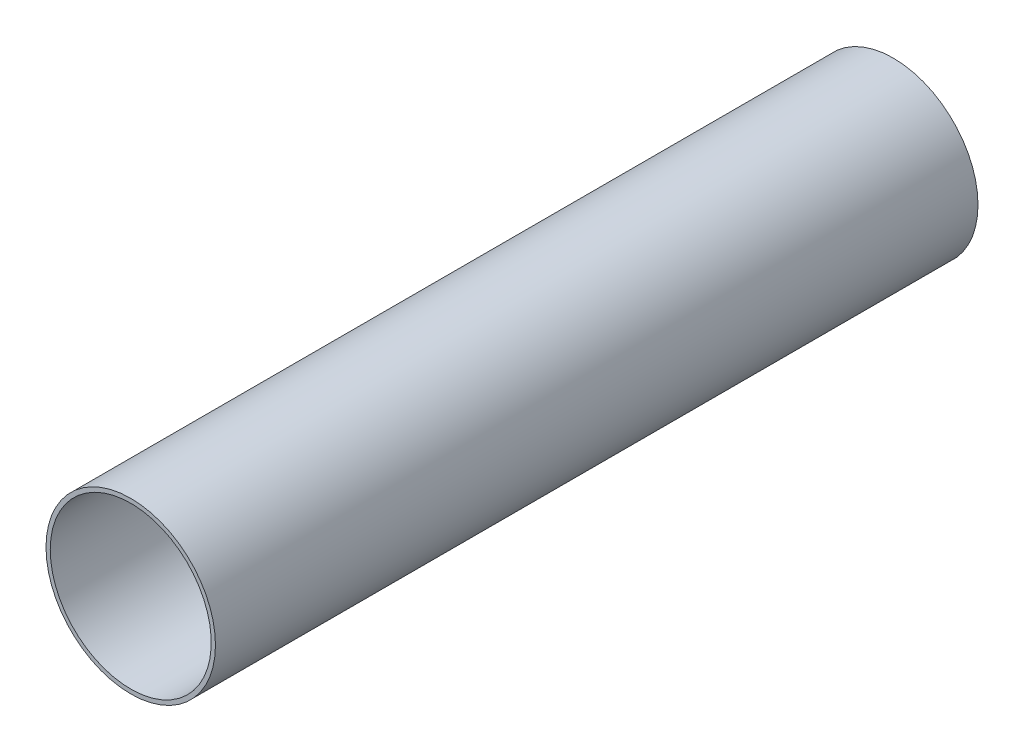
ISO-10303-21;
HEADER;
FILE_DESCRIPTION(('STEP AP214'),'2;1');
FILE_NAME('part.step','',(''),(''),'','','');
FILE_SCHEMA(('AUTOMOTIVE_DESIGN { 1 0 10303 214 1 1 1 1 }'));
ENDSEC;
DATA;
#1=APPLICATION_CONTEXT('core data for automotive mechanical design processes');
#2=APPLICATION_PROTOCOL_DEFINITION('international standard','automotive_design',2000,#1);
#3=PRODUCT_CONTEXT('',#1,'mechanical');
#4=PRODUCT('Part','Part','',(#3));
#5=PRODUCT_RELATED_PRODUCT_CATEGORY('part','',(#4));
#6=PRODUCT_DEFINITION_FORMATION('','',#4);
#7=PRODUCT_DEFINITION_CONTEXT('part definition',#1,'design');
#8=PRODUCT_DEFINITION('design','',#6,#7);
#9=PRODUCT_DEFINITION_SHAPE('','',#8);
#10=(LENGTH_UNIT() NAMED_UNIT(*) SI_UNIT(.MILLI.,.METRE.));
#11=(NAMED_UNIT(*) PLANE_ANGLE_UNIT() SI_UNIT($,.RADIAN.));
#12=(NAMED_UNIT(*) SI_UNIT($,.STERADIAN.) SOLID_ANGLE_UNIT());
#13=UNCERTAINTY_MEASURE_WITH_UNIT(LENGTH_MEASURE(1.E-05),#10,'distance_accuracy_value','');
#14=(GEOMETRIC_REPRESENTATION_CONTEXT(3) GLOBAL_UNCERTAINTY_ASSIGNED_CONTEXT((#13)) GLOBAL_UNIT_ASSIGNED_CONTEXT((#10,
#11,#12)) REPRESENTATION_CONTEXT('',''));
#15=CARTESIAN_POINT('',(0.,0.,0.));
#16=DIRECTION('',(0.,0.,1.));
#17=DIRECTION('',(1.,0.,0.));
#18=AXIS2_PLACEMENT_3D('',#15,#16,#17);
#19=CARTESIAN_POINT('',(0.,0.,90.));
#20=DIRECTION('',(0.,0.,1.));
#21=DIRECTION('',(1.,0.,0.));
#22=AXIS2_PLACEMENT_3D('',#19,#20,#21);
#23=PLANE('',#22);
#24=CARTESIAN_POINT('',(0.,0.,90.));
#25=DIRECTION('',(0.,0.,1.));
#26=DIRECTION('',(1.,0.,0.));
#27=AXIS2_PLACEMENT_3D('',#24,#25,#26);
#28=CIRCLE('',#27,10.);
#29=CARTESIAN_POINT('',(-10.,0.,90.));
#30=VERTEX_POINT('',#29);
#31=EDGE_CURVE('E10',#30,#30,#28,.T.);
#32=ORIENTED_EDGE('',*,*,#31,.T.);
#33=EDGE_LOOP('',(#32));
#34=FACE_BOUND('',#33,.T.);
#35=CARTESIAN_POINT('',(0.,0.,90.));
#36=DIRECTION('',(0.,0.,1.));
#37=DIRECTION('',(1.,0.,0.));
#38=AXIS2_PLACEMENT_3D('',#35,#36,#37);
#39=CIRCLE('',#38,9.5);
#40=CARTESIAN_POINT('',(-9.5,0.,90.));
#41=VERTEX_POINT('',#40);
#42=EDGE_CURVE('E41',#41,#41,#39,.T.);
#43=ORIENTED_EDGE('',*,*,#42,.F.);
#44=EDGE_LOOP('',(#43));
#45=FACE_BOUND('',#44,.T.);
#46=ADVANCED_FACE('F30',(#34,#45),#23,.T.);
#47=CARTESIAN_POINT('',(0.,0.,0.));
#48=DIRECTION('',(0.,0.,1.));
#49=DIRECTION('',(1.,0.,0.));
#50=AXIS2_PLACEMENT_3D('',#47,#48,#49);
#51=PLANE('',#50);
#52=CARTESIAN_POINT('',(0.,0.,0.));
#53=DIRECTION('',(0.,0.,1.));
#54=DIRECTION('',(1.,0.,0.));
#55=AXIS2_PLACEMENT_3D('',#52,#53,#54);
#56=CIRCLE('',#55,10.);
#57=CARTESIAN_POINT('',(-10.,0.,0.));
#58=VERTEX_POINT('',#57);
#59=EDGE_CURVE('E34',#58,#58,#56,.T.);
#60=ORIENTED_EDGE('',*,*,#59,.F.);
#61=EDGE_LOOP('',(#60));
#62=FACE_BOUND('',#61,.T.);
#63=CARTESIAN_POINT('',(0.,0.,0.));
#64=DIRECTION('',(0.,0.,1.));
#65=DIRECTION('',(1.,0.,0.));
#66=AXIS2_PLACEMENT_3D('',#63,#64,#65);
#67=CIRCLE('',#66,9.5);
#68=CARTESIAN_POINT('',(-9.5,0.,0.));
#69=VERTEX_POINT('',#68);
#70=EDGE_CURVE('E43',#69,#69,#67,.T.);
#71=ORIENTED_EDGE('',*,*,#70,.T.);
#72=EDGE_LOOP('',(#71));
#73=FACE_BOUND('',#72,.T.);
#74=ADVANCED_FACE('F53',(#62,#73),#51,.F.);
#75=CARTESIAN_POINT('',(0.,0.,90.));
#76=DIRECTION('',(0.,0.,-1.));
#77=DIRECTION('',(-1.,0.,0.));
#78=AXIS2_PLACEMENT_3D('',#75,#76,#77);
#79=CYLINDRICAL_SURFACE('',#78,10.);
#80=CARTESIAN_POINT('',(-10.,0.,90.));
#81=CARTESIAN_POINT('',(-10.,0.,89.0625));
#82=CARTESIAN_POINT('',(-10.,0.,88.125));
#83=CARTESIAN_POINT('',(-10.,0.,86.25));
#84=CARTESIAN_POINT('',(-10.,0.,85.3125));
#85=CARTESIAN_POINT('',(-10.,0.,83.4375));
#86=CARTESIAN_POINT('',(-10.,0.,82.5));
#87=CARTESIAN_POINT('',(-10.,0.,80.625));
#88=CARTESIAN_POINT('',(-10.,0.,79.6875));
#89=CARTESIAN_POINT('',(-10.,0.,77.8125));
#90=CARTESIAN_POINT('',(-10.,0.,76.875));
#91=CARTESIAN_POINT('',(-10.,0.,75.));
#92=CARTESIAN_POINT('',(-10.,0.,74.0625));
#93=CARTESIAN_POINT('',(-10.,0.,72.1875));
#94=CARTESIAN_POINT('',(-10.,0.,71.25));
#95=CARTESIAN_POINT('',(-10.,0.,69.375));
#96=CARTESIAN_POINT('',(-10.,0.,68.4375));
#97=CARTESIAN_POINT('',(-10.,0.,66.5625));
#98=CARTESIAN_POINT('',(-10.,0.,65.625));
#99=CARTESIAN_POINT('',(-10.,0.,63.75));
#100=CARTESIAN_POINT('',(-10.,0.,62.8125));
#101=CARTESIAN_POINT('',(-10.,0.,60.9375));
#102=CARTESIAN_POINT('',(-10.,0.,60.));
#103=CARTESIAN_POINT('',(-10.,0.,58.125));
#104=CARTESIAN_POINT('',(-10.,0.,57.1875));
#105=CARTESIAN_POINT('',(-10.,0.,55.3125));
#106=CARTESIAN_POINT('',(-10.,0.,54.375));
#107=CARTESIAN_POINT('',(-10.,0.,52.5));
#108=CARTESIAN_POINT('',(-10.,0.,51.5625));
#109=CARTESIAN_POINT('',(-10.,0.,49.6875));
#110=CARTESIAN_POINT('',(-10.,0.,48.75));
#111=CARTESIAN_POINT('',(-10.,0.,46.875));
#112=CARTESIAN_POINT('',(-10.,0.,45.9375));
#113=CARTESIAN_POINT('',(-10.,0.,44.0625));
#114=CARTESIAN_POINT('',(-10.,0.,43.125));
#115=CARTESIAN_POINT('',(-10.,0.,41.25));
#116=CARTESIAN_POINT('',(-10.,0.,40.3125));
#117=CARTESIAN_POINT('',(-10.,0.,38.4375));
#118=CARTESIAN_POINT('',(-10.,0.,37.5));
#119=CARTESIAN_POINT('',(-10.,0.,35.625));
#120=CARTESIAN_POINT('',(-10.,0.,34.6875));
#121=CARTESIAN_POINT('',(-10.,0.,32.8125));
#122=CARTESIAN_POINT('',(-10.,0.,31.875));
#123=CARTESIAN_POINT('',(-10.,0.,30.));
#124=CARTESIAN_POINT('',(-10.,0.,29.0625));
#125=CARTESIAN_POINT('',(-10.,0.,27.1875));
#126=CARTESIAN_POINT('',(-10.,0.,26.25));
#127=CARTESIAN_POINT('',(-10.,0.,24.375));
#128=CARTESIAN_POINT('',(-10.,0.,23.4375));
#129=CARTESIAN_POINT('',(-10.,0.,21.5625));
#130=CARTESIAN_POINT('',(-10.,0.,20.625));
#131=CARTESIAN_POINT('',(-10.,0.,18.75));
#132=CARTESIAN_POINT('',(-10.,0.,17.8125));
#133=CARTESIAN_POINT('',(-10.,0.,15.9375));
#134=CARTESIAN_POINT('',(-10.,0.,15.));
#135=CARTESIAN_POINT('',(-10.,0.,13.125));
#136=CARTESIAN_POINT('',(-10.,0.,12.1875));
#137=CARTESIAN_POINT('',(-10.,0.,10.3125));
#138=CARTESIAN_POINT('',(-10.,0.,9.37499999999999));
#139=CARTESIAN_POINT('',(-10.,0.,7.49999999999999));
#140=CARTESIAN_POINT('',(-10.,0.,6.56249999999999));
#141=CARTESIAN_POINT('',(-10.,0.,4.68749999999999));
#142=CARTESIAN_POINT('',(-10.,0.,3.74999999999998));
#143=CARTESIAN_POINT('',(-10.,0.,1.87499999999998));
#144=CARTESIAN_POINT('',(-10.,0.,0.937499999999986));
#145=CARTESIAN_POINT('',(-10.,0.,0.));
#146=B_SPLINE_CURVE_WITH_KNOTS('',3,(#80,#81,#82,#83,#84,#85,#86,#87,#88,#89,#90,#91,#92,#93,
#94,#95,#96,#97,#98,#99,#100,#101,#102,#103,#104,#105,#106,#107,#108,#109,#110,#111,#112,#113,
#114,#115,#116,#117,#118,#119,#120,#121,#122,#123,#124,#125,#126,#127,#128,#129,#130,#131,#132,
#133,#134,#135,#136,#137,#138,#139,#140,#141,#142,#143,#144,#145),.UNSPECIFIED.,.F.,.F.,(4,2,2,
2,2,2,2,2,2,2,2,2,2,2,2,2,2,2,2,2,2,2,2,2,2,2,2,2,2,2,2,2,4),(0.,2.81250000000001,
5.62500000000001,8.43750000000001,11.25,14.0625,16.875,19.6875,22.5,25.3125,28.125,30.9375,
33.75,36.5625,39.375,42.1875,45.,47.8125,50.625,53.4375,56.25,59.0625,61.875,64.6875,67.5,
70.3125,73.125,75.9375,78.75,81.5625,84.375,87.1875,90.),.UNSPECIFIED.);
#147=EDGE_CURVE('BSEAM32',#30,#58,#146,.T.);
#148=ORIENTED_EDGE('',*,*,#31,.F.);
#149=ORIENTED_EDGE('',*,*,#59,.T.);
#150=ORIENTED_EDGE('',*,*,#147,.T.);
#151=ORIENTED_EDGE('',*,*,#147,.F.);
#152=EDGE_LOOP('',(#148,#150,#149,#151));
#153=FACE_BOUND('',#152,.T.);
#154=ADVANCED_FACE('F32',(#153),#79,.T.);
#155=CARTESIAN_POINT('',(0.,0.,90.));
#156=DIRECTION('',(0.,0.,-1.));
#157=DIRECTION('',(-1.,0.,0.));
#158=AXIS2_PLACEMENT_3D('',#155,#156,#157);
#159=CYLINDRICAL_SURFACE('',#158,9.5);
#160=CARTESIAN_POINT('',(-9.5,0.,90.));
#161=CARTESIAN_POINT('',(-9.5,0.,89.0625));
#162=CARTESIAN_POINT('',(-9.5,0.,88.125));
#163=CARTESIAN_POINT('',(-9.5,0.,86.25));
#164=CARTESIAN_POINT('',(-9.5,0.,85.3125));
#165=CARTESIAN_POINT('',(-9.5,0.,83.4375));
#166=CARTESIAN_POINT('',(-9.5,0.,82.5));
#167=CARTESIAN_POINT('',(-9.5,0.,80.625));
#168=CARTESIAN_POINT('',(-9.5,0.,79.6875));
#169=CARTESIAN_POINT('',(-9.5,0.,77.8125));
#170=CARTESIAN_POINT('',(-9.5,0.,76.875));
#171=CARTESIAN_POINT('',(-9.5,0.,75.));
#172=CARTESIAN_POINT('',(-9.5,0.,74.0625));
#173=CARTESIAN_POINT('',(-9.5,0.,72.1875));
#174=CARTESIAN_POINT('',(-9.5,0.,71.25));
#175=CARTESIAN_POINT('',(-9.5,0.,69.375));
#176=CARTESIAN_POINT('',(-9.5,0.,68.4375));
#177=CARTESIAN_POINT('',(-9.5,0.,66.5625));
#178=CARTESIAN_POINT('',(-9.5,0.,65.625));
#179=CARTESIAN_POINT('',(-9.5,0.,63.75));
#180=CARTESIAN_POINT('',(-9.5,0.,62.8125));
#181=CARTESIAN_POINT('',(-9.5,0.,60.9375));
#182=CARTESIAN_POINT('',(-9.5,0.,60.));
#183=CARTESIAN_POINT('',(-9.5,0.,58.125));
#184=CARTESIAN_POINT('',(-9.5,0.,57.1875));
#185=CARTESIAN_POINT('',(-9.5,0.,55.3125));
#186=CARTESIAN_POINT('',(-9.5,0.,54.375));
#187=CARTESIAN_POINT('',(-9.5,0.,52.5));
#188=CARTESIAN_POINT('',(-9.5,0.,51.5625));
#189=CARTESIAN_POINT('',(-9.5,0.,49.6875));
#190=CARTESIAN_POINT('',(-9.5,0.,48.75));
#191=CARTESIAN_POINT('',(-9.5,0.,46.875));
#192=CARTESIAN_POINT('',(-9.5,0.,45.9375));
#193=CARTESIAN_POINT('',(-9.5,0.,44.0625));
#194=CARTESIAN_POINT('',(-9.5,0.,43.125));
#195=CARTESIAN_POINT('',(-9.5,0.,41.25));
#196=CARTESIAN_POINT('',(-9.5,0.,40.3125));
#197=CARTESIAN_POINT('',(-9.5,0.,38.4375));
#198=CARTESIAN_POINT('',(-9.5,0.,37.5));
#199=CARTESIAN_POINT('',(-9.5,0.,35.625));
#200=CARTESIAN_POINT('',(-9.5,0.,34.6875));
#201=CARTESIAN_POINT('',(-9.5,0.,32.8125));
#202=CARTESIAN_POINT('',(-9.5,0.,31.875));
#203=CARTESIAN_POINT('',(-9.5,0.,30.));
#204=CARTESIAN_POINT('',(-9.5,0.,29.0625));
#205=CARTESIAN_POINT('',(-9.5,0.,27.1875));
#206=CARTESIAN_POINT('',(-9.5,0.,26.25));
#207=CARTESIAN_POINT('',(-9.5,0.,24.375));
#208=CARTESIAN_POINT('',(-9.5,0.,23.4375));
#209=CARTESIAN_POINT('',(-9.5,0.,21.5625));
#210=CARTESIAN_POINT('',(-9.5,0.,20.625));
#211=CARTESIAN_POINT('',(-9.5,0.,18.75));
#212=CARTESIAN_POINT('',(-9.5,0.,17.8125));
#213=CARTESIAN_POINT('',(-9.5,0.,15.9375));
#214=CARTESIAN_POINT('',(-9.5,0.,15.));
#215=CARTESIAN_POINT('',(-9.5,0.,13.125));
#216=CARTESIAN_POINT('',(-9.5,0.,12.1875));
#217=CARTESIAN_POINT('',(-9.5,0.,10.3125));
#218=CARTESIAN_POINT('',(-9.5,0.,9.37499999999999));
#219=CARTESIAN_POINT('',(-9.5,0.,7.49999999999999));
#220=CARTESIAN_POINT('',(-9.5,0.,6.56249999999999));
#221=CARTESIAN_POINT('',(-9.5,0.,4.68749999999999));
#222=CARTESIAN_POINT('',(-9.5,0.,3.74999999999998));
#223=CARTESIAN_POINT('',(-9.5,0.,1.87499999999998));
#224=CARTESIAN_POINT('',(-9.5,0.,0.937499999999986));
#225=CARTESIAN_POINT('',(-9.5,0.,0.));
#226=B_SPLINE_CURVE_WITH_KNOTS('',3,(#160,#161,#162,#163,#164,#165,#166,#167,#168,#169,#170,
#171,#172,#173,#174,#175,#176,#177,#178,#179,#180,#181,#182,#183,#184,#185,#186,#187,#188,#189,
#190,#191,#192,#193,#194,#195,#196,#197,#198,#199,#200,#201,#202,#203,#204,#205,#206,#207,#208,
#209,#210,#211,#212,#213,#214,#215,#216,#217,#218,#219,#220,#221,#222,#223,#224,#225),
.UNSPECIFIED.,.F.,.F.,(4,2,2,2,2,2,2,2,2,2,2,2,2,2,2,2,2,2,2,2,2,2,2,2,2,2,2,2,2,2,2,2,4),(0.,
2.81250000000001,5.62500000000001,8.43750000000001,11.25,14.0625,16.875,19.6875,22.5,25.3125,
28.125,30.9375,33.75,36.5625,39.375,42.1875,45.,47.8125,50.625,53.4375,56.25,59.0625,61.875,
64.6875,67.5,70.3125,73.125,75.9375,78.75,81.5625,84.375,87.1875,90.),.UNSPECIFIED.);
#227=EDGE_CURVE('BSEAM49',#41,#69,#226,.T.);
#228=ORIENTED_EDGE('',*,*,#42,.T.);
#229=ORIENTED_EDGE('',*,*,#70,.F.);
#230=ORIENTED_EDGE('',*,*,#227,.T.);
#231=ORIENTED_EDGE('',*,*,#227,.F.);
#232=EDGE_LOOP('',(#228,#230,#229,#231));
#233=FACE_BOUND('',#232,.T.);
#234=ADVANCED_FACE('F49',(#233),#159,.F.);
#235=CLOSED_SHELL('',(#46,#74,#154,#234));
#236=MANIFOLD_SOLID_BREP('B2',#235);
#237=ADVANCED_BREP_SHAPE_REPRESENTATION('',(#18,#236),#14);
#238=SHAPE_DEFINITION_REPRESENTATION(#9,#237);
ENDSEC;
END-ISO-10303-21;
